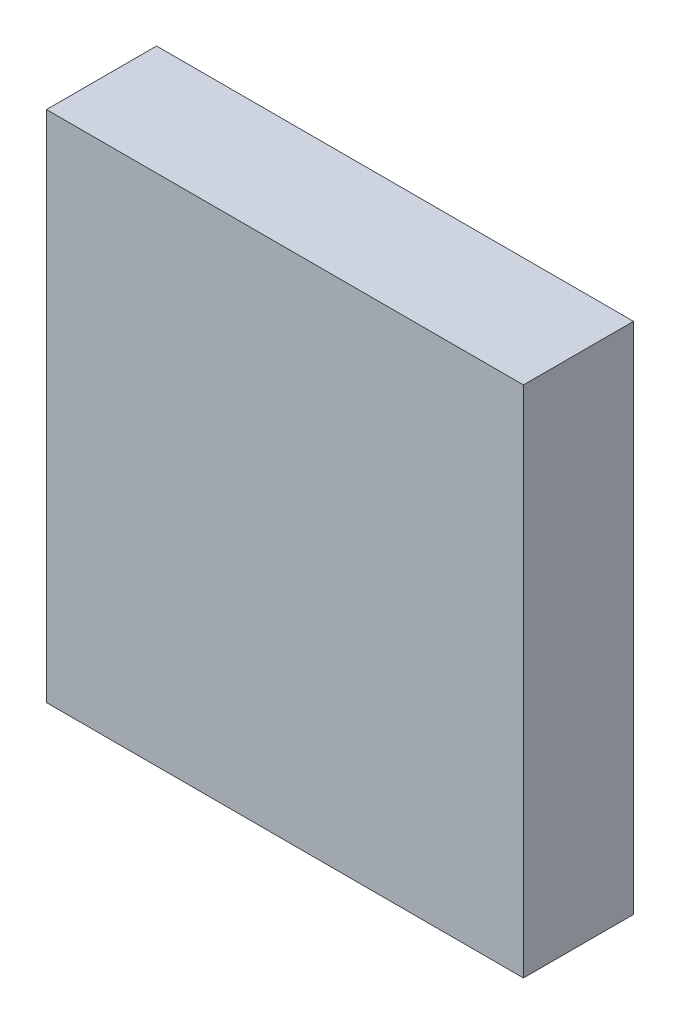
ISO-10303-21;
HEADER;
FILE_DESCRIPTION(('STEP AP214'),'2;1');
FILE_NAME('part.step','',(''),(''),'','','');
FILE_SCHEMA(('AUTOMOTIVE_DESIGN { 1 0 10303 214 1 1 1 1 }'));
ENDSEC;
DATA;
#1=APPLICATION_CONTEXT('core data for automotive mechanical design processes');
#2=APPLICATION_PROTOCOL_DEFINITION('international standard','automotive_design',2000,#1);
#3=PRODUCT_CONTEXT('',#1,'mechanical');
#4=PRODUCT('Part','Part','',(#3));
#5=PRODUCT_RELATED_PRODUCT_CATEGORY('part','',(#4));
#6=PRODUCT_DEFINITION_FORMATION('','',#4);
#7=PRODUCT_DEFINITION_CONTEXT('part definition',#1,'design');
#8=PRODUCT_DEFINITION('design','',#6,#7);
#9=PRODUCT_DEFINITION_SHAPE('','',#8);
#10=(LENGTH_UNIT() NAMED_UNIT(*) SI_UNIT(.MILLI.,.METRE.));
#11=(NAMED_UNIT(*) PLANE_ANGLE_UNIT() SI_UNIT($,.RADIAN.));
#12=(NAMED_UNIT(*) SI_UNIT($,.STERADIAN.) SOLID_ANGLE_UNIT());
#13=UNCERTAINTY_MEASURE_WITH_UNIT(LENGTH_MEASURE(1.E-05),#10,'distance_accuracy_value','');
#14=(GEOMETRIC_REPRESENTATION_CONTEXT(3) GLOBAL_UNCERTAINTY_ASSIGNED_CONTEXT((#13)) GLOBAL_UNIT_ASSIGNED_CONTEXT((#10,
#11,#12)) REPRESENTATION_CONTEXT('',''));
#15=CARTESIAN_POINT('',(0.,0.,0.));
#16=DIRECTION('',(0.,0.,1.));
#17=DIRECTION('',(1.,0.,0.));
#18=AXIS2_PLACEMENT_3D('',#15,#16,#17);
#19=CARTESIAN_POINT('',(0.,0.,3.));
#20=DIRECTION('',(1.,0.,0.));
#21=DIRECTION('',(0.,0.,-1.));
#22=AXIS2_PLACEMENT_3D('',#19,#20,#21);
#23=PLANE('',#22);
#24=DIRECTION('',(0.,-1.,0.));
#25=VECTOR('',#24,1.);
#26=CARTESIAN_POINT('',(0.,0.,0.));
#27=LINE('',#26,#25);
#28=CARTESIAN_POINT('',(0.,14.,0.));
#29=VERTEX_POINT('',#28);
#30=CARTESIAN_POINT('',(0.,0.,0.));
#31=VERTEX_POINT('',#30);
#32=EDGE_CURVE('E98',#29,#31,#27,.T.);
#33=ORIENTED_EDGE('',*,*,#32,.T.);
#34=DIRECTION('',(0.,0.,-1.));
#35=VECTOR('',#34,1.);
#36=CARTESIAN_POINT('',(0.,0.,3.));
#37=LINE('',#36,#35);
#38=CARTESIAN_POINT('',(0.,0.,3.));
#39=VERTEX_POINT('',#38);
#40=EDGE_CURVE('E11',#39,#31,#37,.T.);
#41=ORIENTED_EDGE('',*,*,#40,.F.);
#42=DIRECTION('',(0.,-1.,0.));
#43=VECTOR('',#42,1.);
#44=CARTESIAN_POINT('',(0.,0.,3.));
#45=LINE('',#44,#43);
#46=CARTESIAN_POINT('',(0.,14.,3.));
#47=VERTEX_POINT('',#46);
#48=EDGE_CURVE('E86',#47,#39,#45,.T.);
#49=ORIENTED_EDGE('',*,*,#48,.F.);
#50=DIRECTION('',(0.,0.,-1.));
#51=VECTOR('',#50,1.);
#52=CARTESIAN_POINT('',(0.,14.,3.));
#53=LINE('',#52,#51);
#54=EDGE_CURVE('E94',#47,#29,#53,.T.);
#55=ORIENTED_EDGE('',*,*,#54,.T.);
#56=EDGE_LOOP('',(#33,#41,#49,#55));
#57=FACE_BOUND('',#56,.T.);
#58=ADVANCED_FACE('F35',(#57),#23,.F.);
#59=CARTESIAN_POINT('',(0.,0.,3.));
#60=DIRECTION('',(0.,1.,0.));
#61=DIRECTION('',(0.,0.,1.));
#62=AXIS2_PLACEMENT_3D('',#59,#60,#61);
#63=PLANE('',#62);
#64=DIRECTION('',(1.,0.,0.));
#65=VECTOR('',#64,1.);
#66=CARTESIAN_POINT('',(0.,0.,0.));
#67=LINE('',#66,#65);
#68=CARTESIAN_POINT('',(13.,0.,0.));
#69=VERTEX_POINT('',#68);
#70=EDGE_CURVE('E90',#31,#69,#67,.T.);
#71=ORIENTED_EDGE('',*,*,#70,.T.);
#72=DIRECTION('',(0.,0.,-1.));
#73=VECTOR('',#72,1.);
#74=CARTESIAN_POINT('',(13.,0.,3.));
#75=LINE('',#74,#73);
#76=CARTESIAN_POINT('',(13.,0.,3.));
#77=VERTEX_POINT('',#76);
#78=EDGE_CURVE('E43',#77,#69,#75,.T.);
#79=ORIENTED_EDGE('',*,*,#78,.F.);
#80=DIRECTION('',(1.,0.,0.));
#81=VECTOR('',#80,1.);
#82=CARTESIAN_POINT('',(0.,0.,3.));
#83=LINE('',#82,#81);
#84=EDGE_CURVE('E81',#39,#77,#83,.T.);
#85=ORIENTED_EDGE('',*,*,#84,.F.);
#86=ORIENTED_EDGE('',*,*,#40,.T.);
#87=EDGE_LOOP('',(#71,#79,#85,#86));
#88=FACE_BOUND('',#87,.T.);
#89=ADVANCED_FACE('F89',(#88),#63,.F.);
#90=CARTESIAN_POINT('',(13.,0.,3.));
#91=DIRECTION('',(-1.,0.,0.));
#92=DIRECTION('',(0.,0.,1.));
#93=AXIS2_PLACEMENT_3D('',#90,#91,#92);
#94=PLANE('',#93);
#95=DIRECTION('',(0.,1.,0.));
#96=VECTOR('',#95,1.);
#97=CARTESIAN_POINT('',(13.,0.,0.));
#98=LINE('',#97,#96);
#99=CARTESIAN_POINT('',(13.,14.,0.));
#100=VERTEX_POINT('',#99);
#101=EDGE_CURVE('E68',#69,#100,#98,.T.);
#102=ORIENTED_EDGE('',*,*,#101,.T.);
#103=DIRECTION('',(0.,0.,-1.));
#104=VECTOR('',#103,1.);
#105=CARTESIAN_POINT('',(13.,14.,3.));
#106=LINE('',#105,#104);
#107=CARTESIAN_POINT('',(13.,14.,3.));
#108=VERTEX_POINT('',#107);
#109=EDGE_CURVE('E91',#108,#100,#106,.T.);
#110=ORIENTED_EDGE('',*,*,#109,.F.);
#111=DIRECTION('',(0.,1.,0.));
#112=VECTOR('',#111,1.);
#113=CARTESIAN_POINT('',(13.,0.,3.));
#114=LINE('',#113,#112);
#115=EDGE_CURVE('E84',#77,#108,#114,.T.);
#116=ORIENTED_EDGE('',*,*,#115,.F.);
#117=ORIENTED_EDGE('',*,*,#78,.T.);
#118=EDGE_LOOP('',(#102,#110,#116,#117));
#119=FACE_BOUND('',#118,.T.);
#120=ADVANCED_FACE('F92',(#119),#94,.F.);
#121=CARTESIAN_POINT('',(0.,14.,3.));
#122=DIRECTION('',(0.,-1.,0.));
#123=DIRECTION('',(0.,0.,-1.));
#124=AXIS2_PLACEMENT_3D('',#121,#122,#123);
#125=PLANE('',#124);
#126=DIRECTION('',(-1.,0.,0.));
#127=VECTOR('',#126,1.);
#128=CARTESIAN_POINT('',(0.,14.,0.));
#129=LINE('',#128,#127);
#130=EDGE_CURVE('E74',#100,#29,#129,.T.);
#131=ORIENTED_EDGE('',*,*,#130,.T.);
#132=ORIENTED_EDGE('',*,*,#54,.F.);
#133=DIRECTION('',(-1.,0.,0.));
#134=VECTOR('',#133,1.);
#135=CARTESIAN_POINT('',(0.,14.,3.));
#136=LINE('',#135,#134);
#137=EDGE_CURVE('E51',#108,#47,#136,.T.);
#138=ORIENTED_EDGE('',*,*,#137,.F.);
#139=ORIENTED_EDGE('',*,*,#109,.T.);
#140=EDGE_LOOP('',(#131,#132,#138,#139));
#141=FACE_BOUND('',#140,.T.);
#142=ADVANCED_FACE('F105',(#141),#125,.F.);
#143=CARTESIAN_POINT('',(0.,0.,3.));
#144=DIRECTION('',(0.,0.,-1.));
#145=DIRECTION('',(-1.,0.,0.));
#146=AXIS2_PLACEMENT_3D('',#143,#144,#145);
#147=PLANE('',#146);
#148=ORIENTED_EDGE('',*,*,#48,.T.);
#149=ORIENTED_EDGE('',*,*,#84,.T.);
#150=ORIENTED_EDGE('',*,*,#115,.T.);
#151=ORIENTED_EDGE('',*,*,#137,.T.);
#152=EDGE_LOOP('',(#148,#149,#150,#151));
#153=FACE_BOUND('',#152,.T.);
#154=ADVANCED_FACE('F82',(#153),#147,.F.);
#155=CARTESIAN_POINT('',(0.,0.,0.));
#156=DIRECTION('',(0.,0.,-1.));
#157=DIRECTION('',(-1.,0.,0.));
#158=AXIS2_PLACEMENT_3D('',#155,#156,#157);
#159=PLANE('',#158);
#160=ORIENTED_EDGE('',*,*,#32,.F.);
#161=ORIENTED_EDGE('',*,*,#130,.F.);
#162=ORIENTED_EDGE('',*,*,#101,.F.);
#163=ORIENTED_EDGE('',*,*,#70,.F.);
#164=EDGE_LOOP('',(#160,#161,#162,#163));
#165=FACE_BOUND('',#164,.T.);
#166=ADVANCED_FACE('F108',(#165),#159,.T.);
#167=CLOSED_SHELL('',(#58,#89,#120,#142,#154,#166));
#168=MANIFOLD_SOLID_BREP('B2',#167);
#169=ADVANCED_BREP_SHAPE_REPRESENTATION('',(#18,#168),#14);
#170=SHAPE_DEFINITION_REPRESENTATION(#9,#169);
ENDSEC;
END-ISO-10303-21;
